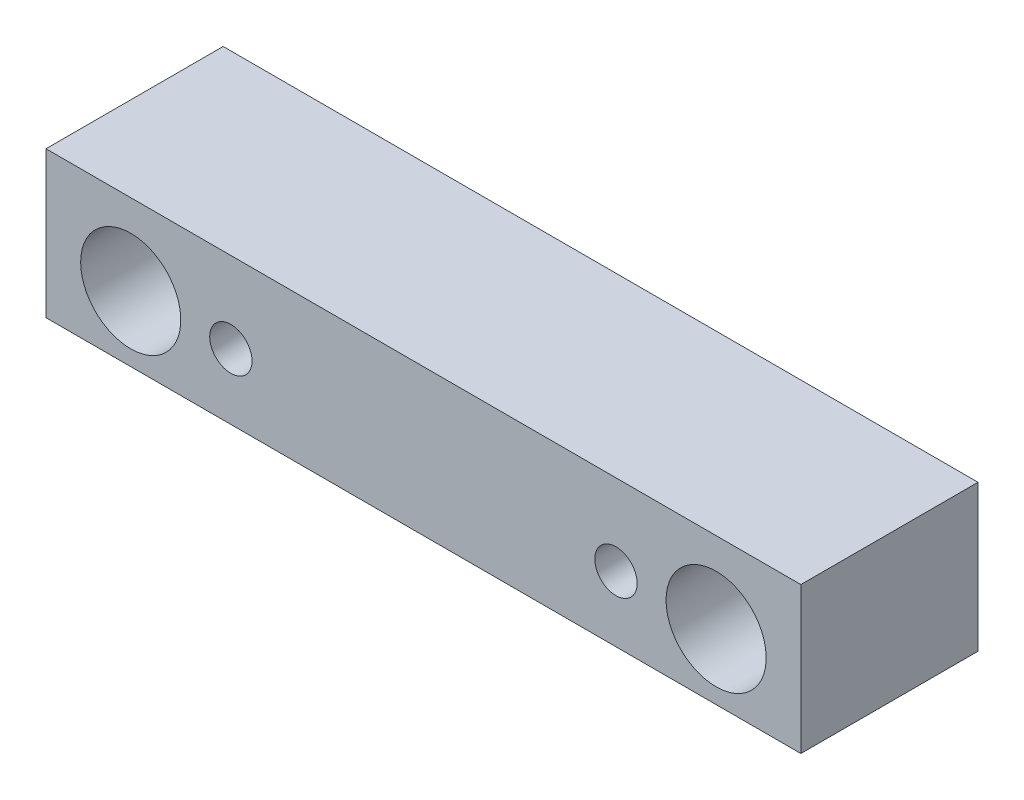
ISO-10303-21;
HEADER;
FILE_DESCRIPTION(('STEP AP214'),'2;1');
FILE_NAME('part.step','',(''),(''),'','','');
FILE_SCHEMA(('AUTOMOTIVE_DESIGN { 1 0 10303 214 1 1 1 1 }'));
ENDSEC;
DATA;
#1=APPLICATION_CONTEXT('core data for automotive mechanical design processes');
#2=APPLICATION_PROTOCOL_DEFINITION('international standard','automotive_design',2000,#1);
#3=PRODUCT_CONTEXT('',#1,'mechanical');
#4=PRODUCT('Part','Part','',(#3));
#5=PRODUCT_RELATED_PRODUCT_CATEGORY('part','',(#4));
#6=PRODUCT_DEFINITION_FORMATION('','',#4);
#7=PRODUCT_DEFINITION_CONTEXT('part definition',#1,'design');
#8=PRODUCT_DEFINITION('design','',#6,#7);
#9=PRODUCT_DEFINITION_SHAPE('','',#8);
#10=(LENGTH_UNIT() NAMED_UNIT(*) SI_UNIT(.MILLI.,.METRE.));
#11=(NAMED_UNIT(*) PLANE_ANGLE_UNIT() SI_UNIT($,.RADIAN.));
#12=(NAMED_UNIT(*) SI_UNIT($,.STERADIAN.) SOLID_ANGLE_UNIT());
#13=UNCERTAINTY_MEASURE_WITH_UNIT(LENGTH_MEASURE(1.E-05),#10,'distance_accuracy_value','');
#14=(GEOMETRIC_REPRESENTATION_CONTEXT(3) GLOBAL_UNCERTAINTY_ASSIGNED_CONTEXT((#13)) GLOBAL_UNIT_ASSIGNED_CONTEXT((#10,
#11,#12)) REPRESENTATION_CONTEXT('',''));
#15=CARTESIAN_POINT('',(0.,0.,0.));
#16=DIRECTION('',(0.,0.,1.));
#17=DIRECTION('',(1.,0.,0.));
#18=AXIS2_PLACEMENT_3D('',#15,#16,#17);
#19=CARTESIAN_POINT('',(98.,98.,0.));
#20=DIRECTION('',(0.,1.,0.));
#21=DIRECTION('',(0.,0.,1.));
#22=AXIS2_PLACEMENT_3D('',#19,#20,#21);
#23=PLANE('',#22);
#24=DIRECTION('',(-1.,0.,0.));
#25=VECTOR('',#24,1.);
#26=CARTESIAN_POINT('',(98.,98.,46.));
#27=LINE('',#26,#25);
#28=CARTESIAN_POINT('',(98.,98.,46.));
#29=VERTEX_POINT('',#28);
#30=CARTESIAN_POINT('',(-98.,98.,46.));
#31=VERTEX_POINT('',#30);
#32=EDGE_CURVE('E102',#29,#31,#27,.T.);
#33=ORIENTED_EDGE('',*,*,#32,.F.);
#34=DIRECTION('',(0.,0.,1.));
#35=VECTOR('',#34,1.);
#36=CARTESIAN_POINT('',(98.,98.,0.));
#37=LINE('',#36,#35);
#38=CARTESIAN_POINT('',(98.,98.,0.));
#39=VERTEX_POINT('',#38);
#40=EDGE_CURVE('E11',#39,#29,#37,.T.);
#41=ORIENTED_EDGE('',*,*,#40,.F.);
#42=DIRECTION('',(-1.,0.,0.));
#43=VECTOR('',#42,1.);
#44=CARTESIAN_POINT('',(98.,98.,0.));
#45=LINE('',#44,#43);
#46=CARTESIAN_POINT('',(-98.,98.,0.));
#47=VERTEX_POINT('',#46);
#48=EDGE_CURVE('E95',#39,#47,#45,.T.);
#49=ORIENTED_EDGE('',*,*,#48,.T.);
#50=DIRECTION('',(0.,0.,1.));
#51=VECTOR('',#50,1.);
#52=CARTESIAN_POINT('',(-98.,98.,0.));
#53=LINE('',#52,#51);
#54=EDGE_CURVE('E40',#47,#31,#53,.T.);
#55=ORIENTED_EDGE('',*,*,#54,.T.);
#56=EDGE_LOOP('',(#33,#41,#49,#55));
#57=FACE_BOUND('',#56,.T.);
#58=ADVANCED_FACE('F37',(#57),#23,.T.);
#59=CARTESIAN_POINT('',(98.,60.,0.));
#60=DIRECTION('',(1.,0.,0.));
#61=DIRECTION('',(0.,0.,-1.));
#62=AXIS2_PLACEMENT_3D('',#59,#60,#61);
#63=PLANE('',#62);
#64=DIRECTION('',(0.,1.,0.));
#65=VECTOR('',#64,1.);
#66=CARTESIAN_POINT('',(98.,60.,46.));
#67=LINE('',#66,#65);
#68=CARTESIAN_POINT('',(98.,60.,46.));
#69=VERTEX_POINT('',#68);
#70=EDGE_CURVE('E97',#69,#29,#67,.T.);
#71=ORIENTED_EDGE('',*,*,#70,.F.);
#72=DIRECTION('',(0.,0.,1.));
#73=VECTOR('',#72,1.);
#74=CARTESIAN_POINT('',(98.,60.,0.));
#75=LINE('',#74,#73);
#76=CARTESIAN_POINT('',(98.,60.,0.));
#77=VERTEX_POINT('',#76);
#78=EDGE_CURVE('E46',#77,#69,#75,.T.);
#79=ORIENTED_EDGE('',*,*,#78,.F.);
#80=DIRECTION('',(0.,1.,0.));
#81=VECTOR('',#80,1.);
#82=CARTESIAN_POINT('',(98.,60.,0.));
#83=LINE('',#82,#81);
#84=EDGE_CURVE('E92',#77,#39,#83,.T.);
#85=ORIENTED_EDGE('',*,*,#84,.T.);
#86=ORIENTED_EDGE('',*,*,#40,.T.);
#87=EDGE_LOOP('',(#71,#79,#85,#86));
#88=FACE_BOUND('',#87,.T.);
#89=ADVANCED_FACE('F113',(#88),#63,.T.);
#90=CARTESIAN_POINT('',(-98.,60.,0.));
#91=DIRECTION('',(0.,-1.,0.));
#92=DIRECTION('',(0.,0.,-1.));
#93=AXIS2_PLACEMENT_3D('',#90,#91,#92);
#94=PLANE('',#93);
#95=DIRECTION('',(1.,0.,0.));
#96=VECTOR('',#95,1.);
#97=CARTESIAN_POINT('',(-98.,60.,46.));
#98=LINE('',#97,#96);
#99=CARTESIAN_POINT('',(-98.,60.,46.));
#100=VERTEX_POINT('',#99);
#101=EDGE_CURVE('E87',#100,#69,#98,.T.);
#102=ORIENTED_EDGE('',*,*,#101,.F.);
#103=DIRECTION('',(0.,0.,1.));
#104=VECTOR('',#103,1.);
#105=CARTESIAN_POINT('',(-98.,60.,0.));
#106=LINE('',#105,#104);
#107=CARTESIAN_POINT('',(-98.,60.,0.));
#108=VERTEX_POINT('',#107);
#109=EDGE_CURVE('E82',#108,#100,#106,.T.);
#110=ORIENTED_EDGE('',*,*,#109,.F.);
#111=DIRECTION('',(1.,0.,0.));
#112=VECTOR('',#111,1.);
#113=CARTESIAN_POINT('',(-98.,60.,0.));
#114=LINE('',#113,#112);
#115=EDGE_CURVE('E85',#108,#77,#114,.T.);
#116=ORIENTED_EDGE('',*,*,#115,.T.);
#117=ORIENTED_EDGE('',*,*,#78,.T.);
#118=EDGE_LOOP('',(#102,#110,#116,#117));
#119=FACE_BOUND('',#118,.T.);
#120=ADVANCED_FACE('F84',(#119),#94,.T.);
#121=CARTESIAN_POINT('',(-98.,98.,0.));
#122=DIRECTION('',(-1.,0.,0.));
#123=DIRECTION('',(0.,0.,1.));
#124=AXIS2_PLACEMENT_3D('',#121,#122,#123);
#125=PLANE('',#124);
#126=DIRECTION('',(0.,-1.,0.));
#127=VECTOR('',#126,1.);
#128=CARTESIAN_POINT('',(-98.,98.,46.));
#129=LINE('',#128,#127);
#130=EDGE_CURVE('E105',#31,#100,#129,.T.);
#131=ORIENTED_EDGE('',*,*,#130,.F.);
#132=ORIENTED_EDGE('',*,*,#54,.F.);
#133=DIRECTION('',(0.,-1.,0.));
#134=VECTOR('',#133,1.);
#135=CARTESIAN_POINT('',(-98.,98.,0.));
#136=LINE('',#135,#134);
#137=EDGE_CURVE('E91',#47,#108,#136,.T.);
#138=ORIENTED_EDGE('',*,*,#137,.T.);
#139=ORIENTED_EDGE('',*,*,#109,.T.);
#140=EDGE_LOOP('',(#131,#132,#138,#139));
#141=FACE_BOUND('',#140,.T.);
#142=ADVANCED_FACE('F94',(#141),#125,.T.);
#143=CARTESIAN_POINT('',(0.,0.,0.));
#144=DIRECTION('',(0.,0.,1.));
#145=DIRECTION('',(1.,0.,0.));
#146=AXIS2_PLACEMENT_3D('',#143,#144,#145);
#147=PLANE('',#146);
#148=CARTESIAN_POINT('',(76.,77.,0.));
#149=DIRECTION('',(0.,0.,1.));
#150=DIRECTION('',(-1.,0.,0.));
#151=AXIS2_PLACEMENT_3D('',#148,#149,#150);
#152=CIRCLE('',#151,13.);
#153=CARTESIAN_POINT('',(63.,77.,0.));
#154=VERTEX_POINT('',#153);
#155=EDGE_CURVE('E154',#154,#154,#152,.T.);
#156=ORIENTED_EDGE('',*,*,#155,.T.);
#157=EDGE_LOOP('',(#156));
#158=FACE_BOUND('',#157,.T.);
#159=CARTESIAN_POINT('',(-76.,77.,0.));
#160=DIRECTION('',(0.,0.,1.));
#161=DIRECTION('',(-1.,0.,0.));
#162=AXIS2_PLACEMENT_3D('',#159,#160,#161);
#163=CIRCLE('',#162,13.);
#164=CARTESIAN_POINT('',(-89.,77.,0.));
#165=VERTEX_POINT('',#164);
#166=EDGE_CURVE('E162',#165,#165,#163,.T.);
#167=ORIENTED_EDGE('',*,*,#166,.T.);
#168=EDGE_LOOP('',(#167));
#169=FACE_BOUND('',#168,.T.);
#170=CARTESIAN_POINT('',(49.9999970794903,76.9998545898096,0.));
#171=DIRECTION('',(0.,0.,1.));
#172=DIRECTION('',(-1.,0.,0.));
#173=AXIS2_PLACEMENT_3D('',#170,#171,#172);
#174=CIRCLE('',#173,5.49999708141255);
#175=CARTESIAN_POINT('',(44.4999999980778,76.9998545898096,0.));
#176=VERTEX_POINT('',#175);
#177=EDGE_CURVE('E168',#176,#176,#174,.T.);
#178=ORIENTED_EDGE('',*,*,#177,.T.);
#179=EDGE_LOOP('',(#178));
#180=FACE_BOUND('',#179,.T.);
#181=CARTESIAN_POINT('',(-50.0000029205097,76.9998545898096,0.));
#182=DIRECTION('',(0.,0.,1.));
#183=DIRECTION('',(-1.,0.,0.));
#184=AXIS2_PLACEMENT_3D('',#181,#182,#183);
#185=CIRCLE('',#184,5.49999708141255);
#186=CARTESIAN_POINT('',(-55.5000000019222,76.9998545898096,0.));
#187=VERTEX_POINT('',#186);
#188=EDGE_CURVE('E106',#187,#187,#185,.T.);
#189=ORIENTED_EDGE('',*,*,#188,.T.);
#190=EDGE_LOOP('',(#189));
#191=FACE_BOUND('',#190,.T.);
#192=ORIENTED_EDGE('',*,*,#48,.F.);
#193=ORIENTED_EDGE('',*,*,#84,.F.);
#194=ORIENTED_EDGE('',*,*,#115,.F.);
#195=ORIENTED_EDGE('',*,*,#137,.F.);
#196=EDGE_LOOP('',(#192,#193,#194,#195));
#197=FACE_BOUND('',#196,.T.);
#198=ADVANCED_FACE('F90',(#158,#169,#180,#191,#197),#147,.F.);
#199=CARTESIAN_POINT('',(0.,0.,46.));
#200=DIRECTION('',(0.,0.,1.));
#201=DIRECTION('',(1.,0.,0.));
#202=AXIS2_PLACEMENT_3D('',#199,#200,#201);
#203=PLANE('',#202);
#204=CARTESIAN_POINT('',(76.,77.,46.));
#205=DIRECTION('',(0.,0.,1.));
#206=DIRECTION('',(-1.,0.,0.));
#207=AXIS2_PLACEMENT_3D('',#204,#205,#206);
#208=CIRCLE('',#207,13.);
#209=CARTESIAN_POINT('',(63.,77.,46.));
#210=VERTEX_POINT('',#209);
#211=EDGE_CURVE('E157',#210,#210,#208,.T.);
#212=ORIENTED_EDGE('',*,*,#211,.F.);
#213=EDGE_LOOP('',(#212));
#214=FACE_BOUND('',#213,.T.);
#215=CARTESIAN_POINT('',(-76.,77.,46.));
#216=DIRECTION('',(0.,0.,1.));
#217=DIRECTION('',(-1.,0.,0.));
#218=AXIS2_PLACEMENT_3D('',#215,#216,#217);
#219=CIRCLE('',#218,13.);
#220=CARTESIAN_POINT('',(-89.,77.,46.));
#221=VERTEX_POINT('',#220);
#222=EDGE_CURVE('E159',#221,#221,#219,.T.);
#223=ORIENTED_EDGE('',*,*,#222,.F.);
#224=EDGE_LOOP('',(#223));
#225=FACE_BOUND('',#224,.T.);
#226=CARTESIAN_POINT('',(49.9999970794903,76.9998545898096,46.));
#227=DIRECTION('',(0.,0.,1.));
#228=DIRECTION('',(-1.,0.,0.));
#229=AXIS2_PLACEMENT_3D('',#226,#227,#228);
#230=CIRCLE('',#229,5.49999708141255);
#231=CARTESIAN_POINT('',(44.4999999980778,76.9998545898096,46.));
#232=VERTEX_POINT('',#231);
#233=EDGE_CURVE('E165',#232,#232,#230,.T.);
#234=ORIENTED_EDGE('',*,*,#233,.F.);
#235=EDGE_LOOP('',(#234));
#236=FACE_BOUND('',#235,.T.);
#237=CARTESIAN_POINT('',(-50.0000029205097,76.9998545898096,46.));
#238=DIRECTION('',(0.,0.,1.));
#239=DIRECTION('',(-1.,0.,0.));
#240=AXIS2_PLACEMENT_3D('',#237,#238,#239);
#241=CIRCLE('',#240,5.49999708141255);
#242=CARTESIAN_POINT('',(-55.5000000019222,76.9998545898096,46.));
#243=VERTEX_POINT('',#242);
#244=EDGE_CURVE('E171',#243,#243,#241,.T.);
#245=ORIENTED_EDGE('',*,*,#244,.F.);
#246=EDGE_LOOP('',(#245));
#247=FACE_BOUND('',#246,.T.);
#248=ORIENTED_EDGE('',*,*,#32,.T.);
#249=ORIENTED_EDGE('',*,*,#130,.T.);
#250=ORIENTED_EDGE('',*,*,#101,.T.);
#251=ORIENTED_EDGE('',*,*,#70,.T.);
#252=EDGE_LOOP('',(#248,#249,#250,#251));
#253=FACE_BOUND('',#252,.T.);
#254=ADVANCED_FACE('F112',(#214,#225,#236,#247,#253),#203,.T.);
#255=CARTESIAN_POINT('',(-50.0000029205097,76.9998545898096,0.));
#256=DIRECTION('',(0.,0.,1.));
#257=DIRECTION('',(1.,0.,0.));
#258=AXIS2_PLACEMENT_3D('',#255,#256,#257);
#259=CYLINDRICAL_SURFACE('',#258,5.49999708141255);
#260=ORIENTED_EDGE('',*,*,#188,.F.);
#261=EDGE_LOOP('',(#260));
#262=FACE_BOUND('',#261,.T.);
#263=ORIENTED_EDGE('',*,*,#244,.T.);
#264=EDGE_LOOP('',(#263));
#265=FACE_BOUND('',#264,.T.);
#266=ADVANCED_FACE('F131',(#262,#265),#259,.F.);
#267=CARTESIAN_POINT('',(49.9999970794903,76.9998545898096,0.));
#268=DIRECTION('',(0.,0.,1.));
#269=DIRECTION('',(1.,0.,0.));
#270=AXIS2_PLACEMENT_3D('',#267,#268,#269);
#271=CYLINDRICAL_SURFACE('',#270,5.49999708141255);
#272=ORIENTED_EDGE('',*,*,#177,.F.);
#273=EDGE_LOOP('',(#272));
#274=FACE_BOUND('',#273,.T.);
#275=ORIENTED_EDGE('',*,*,#233,.T.);
#276=EDGE_LOOP('',(#275));
#277=FACE_BOUND('',#276,.T.);
#278=ADVANCED_FACE('F138',(#274,#277),#271,.F.);
#279=CARTESIAN_POINT('',(-76.,77.,0.));
#280=DIRECTION('',(0.,0.,1.));
#281=DIRECTION('',(1.,0.,0.));
#282=AXIS2_PLACEMENT_3D('',#279,#280,#281);
#283=CYLINDRICAL_SURFACE('',#282,13.);
#284=ORIENTED_EDGE('',*,*,#166,.F.);
#285=EDGE_LOOP('',(#284));
#286=FACE_BOUND('',#285,.T.);
#287=ORIENTED_EDGE('',*,*,#222,.T.);
#288=EDGE_LOOP('',(#287));
#289=FACE_BOUND('',#288,.T.);
#290=ADVANCED_FACE('F142',(#286,#289),#283,.F.);
#291=CARTESIAN_POINT('',(76.,77.,0.));
#292=DIRECTION('',(0.,0.,1.));
#293=DIRECTION('',(1.,0.,0.));
#294=AXIS2_PLACEMENT_3D('',#291,#292,#293);
#295=CYLINDRICAL_SURFACE('',#294,13.);
#296=ORIENTED_EDGE('',*,*,#155,.F.);
#297=EDGE_LOOP('',(#296));
#298=FACE_BOUND('',#297,.T.);
#299=ORIENTED_EDGE('',*,*,#211,.T.);
#300=EDGE_LOOP('',(#299));
#301=FACE_BOUND('',#300,.T.);
#302=ADVANCED_FACE('F146',(#298,#301),#295,.F.);
#303=CLOSED_SHELL('',(#58,#89,#120,#142,#198,#254,#266,#278,#290,#302));
#304=MANIFOLD_SOLID_BREP('B2',#303);
#305=ADVANCED_BREP_SHAPE_REPRESENTATION('',(#18,#304),#14);
#306=SHAPE_DEFINITION_REPRESENTATION(#9,#305);
ENDSEC;
END-ISO-10303-21;
